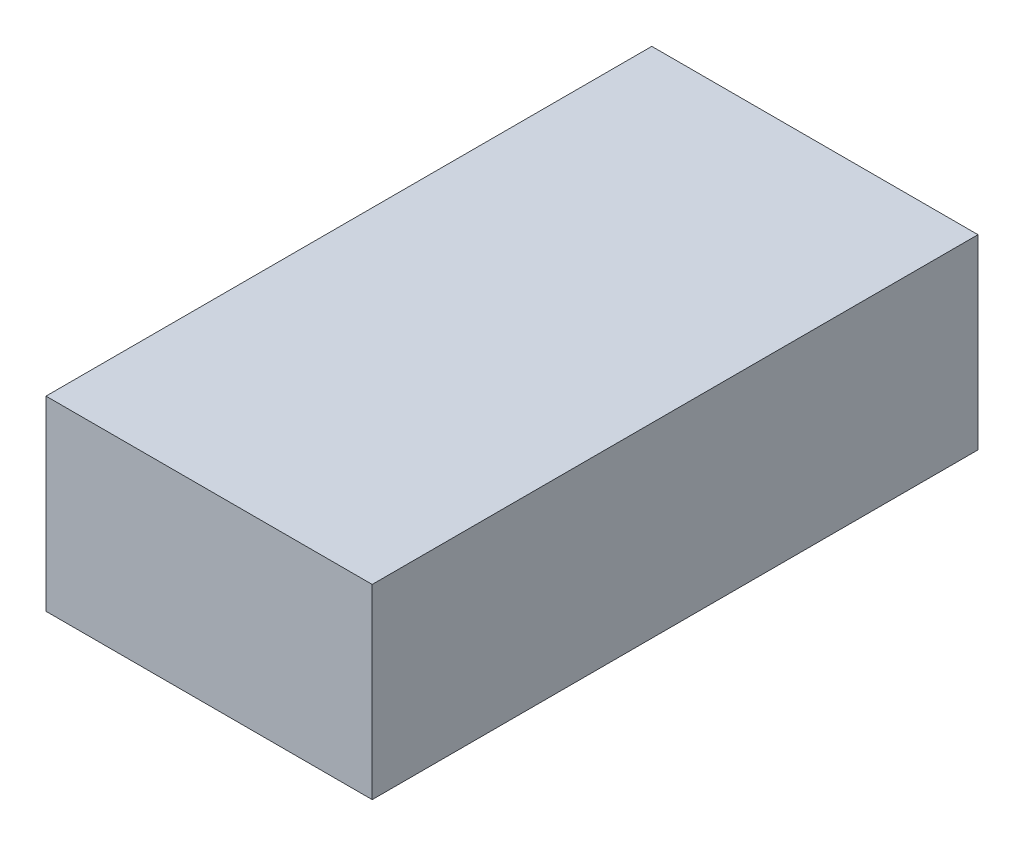
ISO-10303-21;
HEADER;
FILE_DESCRIPTION(('STEP AP214'),'2;1');
FILE_NAME('part.step','',(''),(''),'','','');
FILE_SCHEMA(('AUTOMOTIVE_DESIGN { 1 0 10303 214 1 1 1 1 }'));
ENDSEC;
DATA;
#1=APPLICATION_CONTEXT('core data for automotive mechanical design processes');
#2=APPLICATION_PROTOCOL_DEFINITION('international standard','automotive_design',2000,#1);
#3=PRODUCT_CONTEXT('',#1,'mechanical');
#4=PRODUCT('Part','Part','',(#3));
#5=PRODUCT_RELATED_PRODUCT_CATEGORY('part','',(#4));
#6=PRODUCT_DEFINITION_FORMATION('','',#4);
#7=PRODUCT_DEFINITION_CONTEXT('part definition',#1,'design');
#8=PRODUCT_DEFINITION('design','',#6,#7);
#9=PRODUCT_DEFINITION_SHAPE('','',#8);
#10=(LENGTH_UNIT() NAMED_UNIT(*) SI_UNIT(.MILLI.,.METRE.));
#11=(NAMED_UNIT(*) PLANE_ANGLE_UNIT() SI_UNIT($,.RADIAN.));
#12=(NAMED_UNIT(*) SI_UNIT($,.STERADIAN.) SOLID_ANGLE_UNIT());
#13=UNCERTAINTY_MEASURE_WITH_UNIT(LENGTH_MEASURE(1.E-05),#10,'distance_accuracy_value','');
#14=(GEOMETRIC_REPRESENTATION_CONTEXT(3) GLOBAL_UNCERTAINTY_ASSIGNED_CONTEXT((#13)) GLOBAL_UNIT_ASSIGNED_CONTEXT((#10,
#11,#12)) REPRESENTATION_CONTEXT('',''));
#15=CARTESIAN_POINT('',(0.,0.,0.));
#16=DIRECTION('',(0.,0.,1.));
#17=DIRECTION('',(1.,0.,0.));
#18=AXIS2_PLACEMENT_3D('',#15,#16,#17);
#19=CARTESIAN_POINT('',(60.,1174.,-360.));
#20=DIRECTION('',(-1.,0.,0.));
#21=DIRECTION('',(0.,0.,1.));
#22=AXIS2_PLACEMENT_3D('',#19,#20,#21);
#23=PLANE('',#22);
#24=DIRECTION('',(0.,-1.,0.));
#25=VECTOR('',#24,1.);
#26=CARTESIAN_POINT('',(60.,1174.,-100.));
#27=LINE('',#26,#25);
#28=CARTESIAN_POINT('',(60.,1254.,-100.));
#29=VERTEX_POINT('',#28);
#30=CARTESIAN_POINT('',(60.,1174.,-100.));
#31=VERTEX_POINT('',#30);
#32=EDGE_CURVE('E103',#29,#31,#27,.T.);
#33=ORIENTED_EDGE('',*,*,#32,.F.);
#34=DIRECTION('',(0.,0.,1.));
#35=VECTOR('',#34,1.);
#36=CARTESIAN_POINT('',(60.,1254.,-360.));
#37=LINE('',#36,#35);
#38=CARTESIAN_POINT('',(60.,1254.,-360.));
#39=VERTEX_POINT('',#38);
#40=EDGE_CURVE('E11',#39,#29,#37,.T.);
#41=ORIENTED_EDGE('',*,*,#40,.F.);
#42=DIRECTION('',(0.,-1.,0.));
#43=VECTOR('',#42,1.);
#44=CARTESIAN_POINT('',(60.,1174.,-360.));
#45=LINE('',#44,#43);
#46=CARTESIAN_POINT('',(60.,1174.,-360.));
#47=VERTEX_POINT('',#46);
#48=EDGE_CURVE('E97',#39,#47,#45,.T.);
#49=ORIENTED_EDGE('',*,*,#48,.T.);
#50=DIRECTION('',(0.,0.,1.));
#51=VECTOR('',#50,1.);
#52=CARTESIAN_POINT('',(60.,1174.,-360.));
#53=LINE('',#52,#51);
#54=EDGE_CURVE('E42',#47,#31,#53,.T.);
#55=ORIENTED_EDGE('',*,*,#54,.T.);
#56=EDGE_LOOP('',(#33,#41,#49,#55));
#57=FACE_BOUND('',#56,.T.);
#58=ADVANCED_FACE('F39',(#57),#23,.T.);
#59=CARTESIAN_POINT('',(60.,1254.,-360.));
#60=DIRECTION('',(0.,1.,0.));
#61=DIRECTION('',(0.,0.,1.));
#62=AXIS2_PLACEMENT_3D('',#59,#60,#61);
#63=PLANE('',#62);
#64=DIRECTION('',(-1.,0.,0.));
#65=VECTOR('',#64,1.);
#66=CARTESIAN_POINT('',(60.,1254.,-100.));
#67=LINE('',#66,#65);
#68=CARTESIAN_POINT('',(200.,1254.,-100.));
#69=VERTEX_POINT('',#68);
#70=EDGE_CURVE('E99',#69,#29,#67,.T.);
#71=ORIENTED_EDGE('',*,*,#70,.F.);
#72=DIRECTION('',(0.,0.,1.));
#73=VECTOR('',#72,1.);
#74=CARTESIAN_POINT('',(200.,1254.,-360.));
#75=LINE('',#74,#73);
#76=CARTESIAN_POINT('',(200.,1254.,-360.));
#77=VERTEX_POINT('',#76);
#78=EDGE_CURVE('E48',#77,#69,#75,.T.);
#79=ORIENTED_EDGE('',*,*,#78,.F.);
#80=DIRECTION('',(-1.,0.,0.));
#81=VECTOR('',#80,1.);
#82=CARTESIAN_POINT('',(60.,1254.,-360.));
#83=LINE('',#82,#81);
#84=EDGE_CURVE('E94',#77,#39,#83,.T.);
#85=ORIENTED_EDGE('',*,*,#84,.T.);
#86=ORIENTED_EDGE('',*,*,#40,.T.);
#87=EDGE_LOOP('',(#71,#79,#85,#86));
#88=FACE_BOUND('',#87,.T.);
#89=ADVANCED_FACE('F113',(#88),#63,.T.);
#90=CARTESIAN_POINT('',(200.,1174.,-360.));
#91=DIRECTION('',(1.,0.,0.));
#92=DIRECTION('',(0.,0.,-1.));
#93=AXIS2_PLACEMENT_3D('',#90,#91,#92);
#94=PLANE('',#93);
#95=DIRECTION('',(0.,1.,0.));
#96=VECTOR('',#95,1.);
#97=CARTESIAN_POINT('',(200.,1174.,-100.));
#98=LINE('',#97,#96);
#99=CARTESIAN_POINT('',(200.,1174.,-100.));
#100=VERTEX_POINT('',#99);
#101=EDGE_CURVE('E89',#100,#69,#98,.T.);
#102=ORIENTED_EDGE('',*,*,#101,.F.);
#103=DIRECTION('',(0.,0.,1.));
#104=VECTOR('',#103,1.);
#105=CARTESIAN_POINT('',(200.,1174.,-360.));
#106=LINE('',#105,#104);
#107=CARTESIAN_POINT('',(200.,1174.,-360.));
#108=VERTEX_POINT('',#107);
#109=EDGE_CURVE('E84',#108,#100,#106,.T.);
#110=ORIENTED_EDGE('',*,*,#109,.F.);
#111=DIRECTION('',(0.,1.,0.));
#112=VECTOR('',#111,1.);
#113=CARTESIAN_POINT('',(200.,1174.,-360.));
#114=LINE('',#113,#112);
#115=EDGE_CURVE('E87',#108,#77,#114,.T.);
#116=ORIENTED_EDGE('',*,*,#115,.T.);
#117=ORIENTED_EDGE('',*,*,#78,.T.);
#118=EDGE_LOOP('',(#102,#110,#116,#117));
#119=FACE_BOUND('',#118,.T.);
#120=ADVANCED_FACE('F86',(#119),#94,.T.);
#121=CARTESIAN_POINT('',(60.,1174.,-360.));
#122=DIRECTION('',(0.,-1.,0.));
#123=DIRECTION('',(0.,0.,-1.));
#124=AXIS2_PLACEMENT_3D('',#121,#122,#123);
#125=PLANE('',#124);
#126=DIRECTION('',(1.,0.,0.));
#127=VECTOR('',#126,1.);
#128=CARTESIAN_POINT('',(60.,1174.,-100.));
#129=LINE('',#128,#127);
#130=EDGE_CURVE('E106',#31,#100,#129,.T.);
#131=ORIENTED_EDGE('',*,*,#130,.F.);
#132=ORIENTED_EDGE('',*,*,#54,.F.);
#133=DIRECTION('',(1.,0.,0.));
#134=VECTOR('',#133,1.);
#135=CARTESIAN_POINT('',(60.,1174.,-360.));
#136=LINE('',#135,#134);
#137=EDGE_CURVE('E93',#47,#108,#136,.T.);
#138=ORIENTED_EDGE('',*,*,#137,.T.);
#139=ORIENTED_EDGE('',*,*,#109,.T.);
#140=EDGE_LOOP('',(#131,#132,#138,#139));
#141=FACE_BOUND('',#140,.T.);
#142=ADVANCED_FACE('F96',(#141),#125,.T.);
#143=CARTESIAN_POINT('',(0.,0.,-360.));
#144=DIRECTION('',(0.,0.,-1.));
#145=DIRECTION('',(-1.,0.,0.));
#146=AXIS2_PLACEMENT_3D('',#143,#144,#145);
#147=PLANE('',#146);
#148=ORIENTED_EDGE('',*,*,#48,.F.);
#149=ORIENTED_EDGE('',*,*,#84,.F.);
#150=ORIENTED_EDGE('',*,*,#115,.F.);
#151=ORIENTED_EDGE('',*,*,#137,.F.);
#152=EDGE_LOOP('',(#148,#149,#150,#151));
#153=FACE_BOUND('',#152,.T.);
#154=ADVANCED_FACE('F92',(#153),#147,.T.);
#155=CARTESIAN_POINT('',(0.,0.,-100.));
#156=DIRECTION('',(0.,0.,-1.));
#157=DIRECTION('',(-1.,0.,0.));
#158=AXIS2_PLACEMENT_3D('',#155,#156,#157);
#159=PLANE('',#158);
#160=ORIENTED_EDGE('',*,*,#32,.T.);
#161=ORIENTED_EDGE('',*,*,#130,.T.);
#162=ORIENTED_EDGE('',*,*,#101,.T.);
#163=ORIENTED_EDGE('',*,*,#70,.T.);
#164=EDGE_LOOP('',(#160,#161,#162,#163));
#165=FACE_BOUND('',#164,.T.);
#166=ADVANCED_FACE('F112',(#165),#159,.F.);
#167=CLOSED_SHELL('',(#58,#89,#120,#142,#154,#166));
#168=MANIFOLD_SOLID_BREP('B2',#167);
#169=ADVANCED_BREP_SHAPE_REPRESENTATION('',(#18,#168),#14);
#170=SHAPE_DEFINITION_REPRESENTATION(#9,#169);
ENDSEC;
END-ISO-10303-21;
